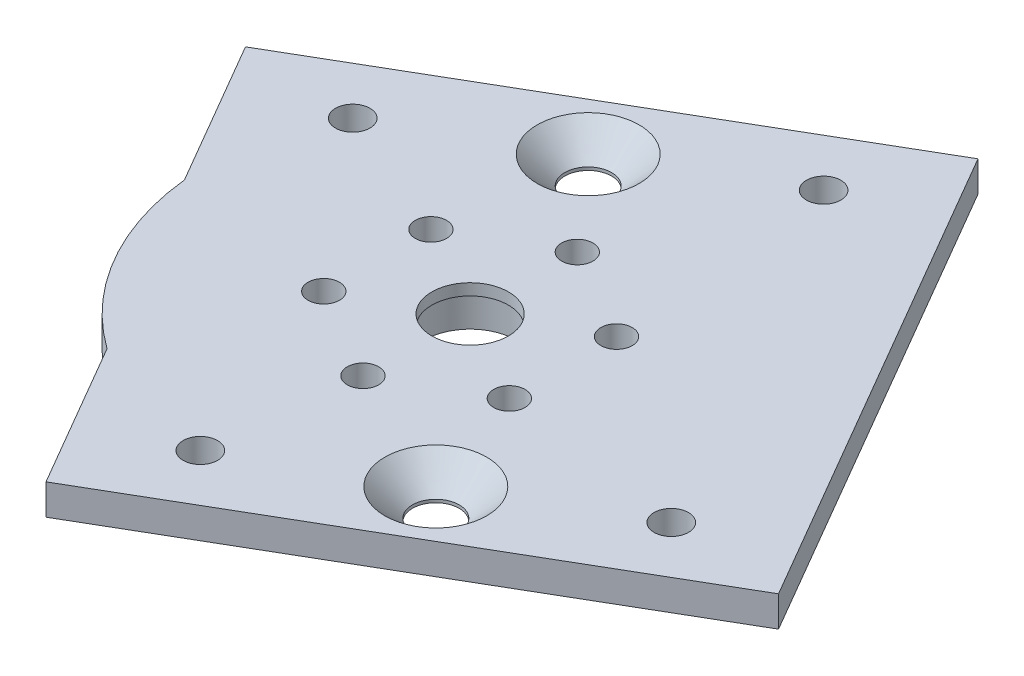
ISO-10303-21;
HEADER;
FILE_DESCRIPTION(('STEP AP214'),'2;1');
FILE_NAME('part.step','',(''),(''),'','','');
FILE_SCHEMA(('AUTOMOTIVE_DESIGN { 1 0 10303 214 1 1 1 1 }'));
ENDSEC;
DATA;
#1=APPLICATION_CONTEXT('core data for automotive mechanical design processes');
#2=APPLICATION_PROTOCOL_DEFINITION('international standard','automotive_design',2000,#1);
#3=PRODUCT_CONTEXT('',#1,'mechanical');
#4=PRODUCT('Part','Part','',(#3));
#5=PRODUCT_RELATED_PRODUCT_CATEGORY('part','',(#4));
#6=PRODUCT_DEFINITION_FORMATION('','',#4);
#7=PRODUCT_DEFINITION_CONTEXT('part definition',#1,'design');
#8=PRODUCT_DEFINITION('design','',#6,#7);
#9=PRODUCT_DEFINITION_SHAPE('','',#8);
#10=(LENGTH_UNIT() NAMED_UNIT(*) SI_UNIT(.MILLI.,.METRE.));
#11=(NAMED_UNIT(*) PLANE_ANGLE_UNIT() SI_UNIT($,.RADIAN.));
#12=(NAMED_UNIT(*) SI_UNIT($,.STERADIAN.) SOLID_ANGLE_UNIT());
#13=UNCERTAINTY_MEASURE_WITH_UNIT(LENGTH_MEASURE(1.E-05),#10,'distance_accuracy_value','');
#14=(GEOMETRIC_REPRESENTATION_CONTEXT(3) GLOBAL_UNCERTAINTY_ASSIGNED_CONTEXT((#13)) GLOBAL_UNIT_ASSIGNED_CONTEXT((#10,
#11,#12)) REPRESENTATION_CONTEXT('',''));
#15=CARTESIAN_POINT('',(0.,0.,0.));
#16=DIRECTION('',(0.,0.,1.));
#17=DIRECTION('',(1.,0.,0.));
#18=AXIS2_PLACEMENT_3D('',#15,#16,#17);
#19=CARTESIAN_POINT('',(0.,0.,0.));
#20=DIRECTION('',(0.,1.,0.));
#21=DIRECTION('',(0.,0.,1.));
#22=AXIS2_PLACEMENT_3D('',#19,#20,#21);
#23=PLANE('',#22);
#24=CARTESIAN_POINT('',(36.7309988166005,0.,10.4562768677418));
#25=DIRECTION('',(0.,-1.,0.));
#26=DIRECTION('',(0.,0.,-1.));
#27=AXIS2_PLACEMENT_3D('',#24,#25,#26);
#28=CIRCLE('',#27,2.25);
#29=CARTESIAN_POINT('',(36.7309988166005,0.,8.20627686774178));
#30=VERTEX_POINT('',#29);
#31=EDGE_CURVE('E248',#30,#30,#28,.T.);
#32=ORIENTED_EDGE('',*,*,#31,.F.);
#33=EDGE_LOOP('',(#32));
#34=FACE_BOUND('',#33,.T.);
#35=CARTESIAN_POINT('',(17.2790417673626,0.,21.764299106604));
#36=DIRECTION('',(0.,-1.,0.));
#37=DIRECTION('',(0.,0.,-1.));
#38=AXIS2_PLACEMENT_3D('',#35,#36,#37);
#39=CIRCLE('',#38,3.05);
#40=CARTESIAN_POINT('',(17.2790417673626,0.,18.714299106604));
#41=VERTEX_POINT('',#40);
#42=EDGE_CURVE('E328',#41,#41,#39,.T.);
#43=ORIENTED_EDGE('',*,*,#42,.F.);
#44=EDGE_LOOP('',(#43));
#45=FACE_BOUND('',#44,.T.);
#46=CARTESIAN_POINT('',(-2.17291528187535,0.,33.0723213454662));
#47=DIRECTION('',(0.,-1.,0.));
#48=DIRECTION('',(0.,0.,-1.));
#49=AXIS2_PLACEMENT_3D('',#46,#47,#48);
#50=CIRCLE('',#49,2.25);
#51=CARTESIAN_POINT('',(-2.17291528187535,0.,30.8223213454662));
#52=VERTEX_POINT('',#51);
#53=EDGE_CURVE('E323',#52,#52,#50,.T.);
#54=ORIENTED_EDGE('',*,*,#53,.F.);
#55=EDGE_LOOP('',(#54));
#56=FACE_BOUND('',#55,.T.);
#57=CARTESIAN_POINT('',(9.08916667715952,0.,-37.0929514748398));
#58=DIRECTION('',(0.,-1.,0.));
#59=DIRECTION('',(0.,0.,-1.));
#60=AXIS2_PLACEMENT_3D('',#57,#58,#59);
#61=CIRCLE('',#60,2.25);
#62=CARTESIAN_POINT('',(9.08916667715952,0.,-39.3429514748398));
#63=VERTEX_POINT('',#62);
#64=EDGE_CURVE('E332',#63,#63,#61,.T.);
#65=ORIENTED_EDGE('',*,*,#64,.F.);
#66=EDGE_LOOP('',(#65));
#67=FACE_BOUND('',#66,.T.);
#68=CARTESIAN_POINT('',(-12.1243556529822,0.,-6.99999999999905));
#69=DIRECTION('',(0.,1.,0.));
#70=DIRECTION('',(0.,0.,1.));
#71=AXIS2_PLACEMENT_3D('',#68,#69,#70);
#72=CIRCLE('',#71,2.05000000000121);
#73=CARTESIAN_POINT('',(-12.1243556529822,0.,-4.94999999999784));
#74=VERTEX_POINT('',#73);
#75=EDGE_CURVE('E181',#74,#74,#72,.T.);
#76=ORIENTED_EDGE('',*,*,#75,.T.);
#77=EDGE_LOOP('',(#76));
#78=FACE_BOUND('',#77,.T.);
#79=CARTESIAN_POINT('',(-12.1243556529807,0.,7.00000000000087));
#80=DIRECTION('',(0.,1.,0.));
#81=DIRECTION('',(0.,0.,1.));
#82=AXIS2_PLACEMENT_3D('',#79,#80,#81);
#83=CIRCLE('',#82,2.05000000000208);
#84=CARTESIAN_POINT('',(-12.1243556529807,0.,9.05000000000295));
#85=VERTEX_POINT('',#84);
#86=EDGE_CURVE('E189',#85,#85,#83,.T.);
#87=ORIENTED_EDGE('',*,*,#86,.T.);
#88=EDGE_LOOP('',(#87));
#89=FACE_BOUND('',#88,.T.);
#90=CARTESIAN_POINT('',(1.98437614357186E-12,0.,14.));
#91=DIRECTION('',(0.,1.,0.));
#92=DIRECTION('',(0.,0.,1.));
#93=AXIS2_PLACEMENT_3D('',#90,#91,#92);
#94=CIRCLE('',#93,2.05000000000225);
#95=CARTESIAN_POINT('',(1.98437614357186E-12,0.,16.0500000000022));
#96=VERTEX_POINT('',#95);
#97=EDGE_CURVE('E197',#96,#96,#94,.T.);
#98=ORIENTED_EDGE('',*,*,#97,.T.);
#99=EDGE_LOOP('',(#98));
#100=FACE_BOUND('',#99,.T.);
#101=CARTESIAN_POINT('',(12.1243556529836,0.,6.99999999999914));
#102=DIRECTION('',(0.,1.,0.));
#103=DIRECTION('',(0.,0.,1.));
#104=AXIS2_PLACEMENT_3D('',#101,#102,#103);
#105=CIRCLE('',#104,2.05000000000147);
#106=CARTESIAN_POINT('',(12.1243556529836,0.,9.05000000000061));
#107=VERTEX_POINT('',#106);
#108=EDGE_CURVE('E205',#107,#107,#105,.T.);
#109=ORIENTED_EDGE('',*,*,#108,.T.);
#110=EDGE_LOOP('',(#109));
#111=FACE_BOUND('',#110,.T.);
#112=CARTESIAN_POINT('',(12.1243556529826,0.,-7.00000000000086));
#113=DIRECTION('',(0.,1.,0.));
#114=DIRECTION('',(0.,0.,1.));
#115=AXIS2_PLACEMENT_3D('',#112,#113,#114);
#116=CIRCLE('',#115,2.05000000000028);
#117=CARTESIAN_POINT('',(12.1243556529826,0.,-4.95000000000058));
#118=VERTEX_POINT('',#117);
#119=EDGE_CURVE('E213',#118,#118,#116,.T.);
#120=ORIENTED_EDGE('',*,*,#119,.T.);
#121=EDGE_LOOP('',(#120));
#122=FACE_BOUND('',#121,.T.);
#123=CARTESIAN_POINT('',(0.,0.,-14.));
#124=DIRECTION('',(0.,1.,0.));
#125=DIRECTION('',(0.,0.,1.));
#126=AXIS2_PLACEMENT_3D('',#123,#124,#125);
#127=CIRCLE('',#126,2.05);
#128=CARTESIAN_POINT('',(0.,0.,-11.95));
#129=VERTEX_POINT('',#128);
#130=EDGE_CURVE('E221',#129,#129,#127,.T.);
#131=ORIENTED_EDGE('',*,*,#130,.T.);
#132=EDGE_LOOP('',(#131));
#133=FACE_BOUND('',#132,.T.);
#134=CARTESIAN_POINT('',(0.,0.,0.));
#135=DIRECTION('',(0.,1.,0.));
#136=DIRECTION('',(0.,0.,1.));
#137=AXIS2_PLACEMENT_3D('',#134,#135,#136);
#138=CIRCLE('',#137,34.);
#139=CARTESIAN_POINT('',(-33.81860468845,0.,3.50741741547083));
#140=VERTEX_POINT('',#139);
#141=CARTESIAN_POINT('',(-19.7823436250058,0.,27.6524660871719));
#142=VERTEX_POINT('',#141);
#143=EDGE_CURVE('E229',#140,#142,#138,.T.);
#144=ORIENTED_EDGE('',*,*,#143,.F.);
#145=DIRECTION('',(-0.502578766171655,0.,-0.864531424410575));
#146=VECTOR('',#145,1.);
#147=CARTESIAN_POINT('',(-26.8004741567279,0.,15.5799417513214));
#148=LINE('',#147,#146);
#149=CARTESIAN_POINT('',(-44.8933097389076,0.,-15.5431895274595));
#150=VERTEX_POINT('',#149);
#151=EDGE_CURVE('E78',#140,#150,#148,.T.);
#152=ORIENTED_EDGE('',*,*,#151,.T.);
#153=DIRECTION('',(-0.864531424410575,0.,0.502578766171655));
#154=VECTOR('',#153,1.);
#155=CARTESIAN_POINT('',(-18.0928355821797,0.,-31.1231312787809));
#156=LINE('',#155,#154);
#157=CARTESIAN_POINT('',(15.6238899698326,0.,-50.7237031594753));
#158=VERTEX_POINT('',#157);
#159=EDGE_CURVE('E118',#158,#150,#156,.T.);
#160=ORIENTED_EDGE('',*,*,#159,.F.);
#161=DIRECTION('',(-0.502578766171655,0.,-0.864531424410575));
#162=VECTOR('',#161,1.);
#163=CARTESIAN_POINT('',(33.7167255520123,0.,-19.6005718806945));
#164=LINE('',#163,#162);
#165=CARTESIAN_POINT('',(51.8095611341918,0.,11.522559398086));
#166=VERTEX_POINT('',#165);
#167=EDGE_CURVE('E130',#166,#158,#164,.T.);
#168=ORIENTED_EDGE('',*,*,#167,.F.);
#169=DIRECTION('',(-0.864531424410575,0.,0.502578766171655));
#170=VECTOR('',#169,1.);
#171=CARTESIAN_POINT('',(18.0928355821794,0.,31.1231312787805));
#172=LINE('',#171,#170);
#173=CARTESIAN_POINT('',(-8.70763857454847,0.,46.7030730301018));
#174=VERTEX_POINT('',#173);
#175=EDGE_CURVE('E136',#166,#174,#172,.T.);
#176=ORIENTED_EDGE('',*,*,#175,.T.);
#177=EDGE_CURVE('E108',#174,#142,#148,.T.);
#178=ORIENTED_EDGE('',*,*,#177,.T.);
#179=EDGE_LOOP('',(#144,#152,#160,#168,#176,#178));
#180=FACE_BOUND('',#179,.T.);
#181=CARTESIAN_POINT('',(0.,0.,0.));
#182=DIRECTION('',(0.,1.,0.));
#183=DIRECTION('',(0.,0.,1.));
#184=AXIS2_PLACEMENT_3D('',#181,#182,#183);
#185=CIRCLE('',#184,7.);
#186=CARTESIAN_POINT('',(0.,0.,7.));
#187=VERTEX_POINT('',#186);
#188=EDGE_CURVE('E236',#187,#187,#185,.F.);
#189=ORIENTED_EDGE('',*,*,#188,.F.);
#190=EDGE_LOOP('',(#189));
#191=FACE_BOUND('',#190,.T.);
#192=CARTESIAN_POINT('',(-10.3627903720784,0.,-25.7849292359776));
#193=DIRECTION('',(0.,-1.,0.));
#194=DIRECTION('',(0.,0.,-1.));
#195=AXIS2_PLACEMENT_3D('',#192,#193,#194);
#196=CIRCLE('',#195,3.05000000000001);
#197=CARTESIAN_POINT('',(-10.3627903720784,0.,-28.8349292359776));
#198=VERTEX_POINT('',#197);
#199=EDGE_CURVE('E324',#198,#198,#196,.F.);
#200=ORIENTED_EDGE('',*,*,#199,.T.);
#201=EDGE_LOOP('',(#200));
#202=FACE_BOUND('',#201,.T.);
#203=CARTESIAN_POINT('',(-29.8147474213163,0.,-14.4769069971153));
#204=DIRECTION('',(0.,-1.,0.));
#205=DIRECTION('',(0.,0.,-1.));
#206=AXIS2_PLACEMENT_3D('',#203,#204,#205);
#207=CIRCLE('',#206,2.25);
#208=CARTESIAN_POINT('',(-29.8147474213163,0.,-16.7269069971153));
#209=VERTEX_POINT('',#208);
#210=EDGE_CURVE('E320',#209,#209,#207,.F.);
#211=ORIENTED_EDGE('',*,*,#210,.T.);
#212=EDGE_LOOP('',(#211));
#213=FACE_BOUND('',#212,.T.);
#214=ADVANCED_FACE('F55',(#34,#45,#56,#67,#78,#89,#100,#111,#122,#133,#180,#191,#202,#213),#23,.F.);
#215=CARTESIAN_POINT('',(0.,4.,0.));
#216=DIRECTION('',(0.,1.,0.));
#217=DIRECTION('',(0.,0.,1.));
#218=AXIS2_PLACEMENT_3D('',#215,#216,#217);
#219=PLANE('',#218);
#220=CARTESIAN_POINT('',(-10.3627903720784,4.,-25.7849292359776));
#221=DIRECTION('',(0.,1.,0.));
#222=DIRECTION('',(0.,0.,1.));
#223=AXIS2_PLACEMENT_3D('',#220,#221,#222);
#224=CIRCLE('',#223,6.65000000000002);
#225=CARTESIAN_POINT('',(-10.3627903720784,4.,-19.1349292359775));
#226=VERTEX_POINT('',#225);
#227=EDGE_CURVE('E262',#226,#226,#224,.F.);
#228=ORIENTED_EDGE('',*,*,#227,.T.);
#229=EDGE_LOOP('',(#228));
#230=FACE_BOUND('',#229,.T.);
#231=CARTESIAN_POINT('',(17.2790417673626,4.,21.764299106604));
#232=DIRECTION('',(0.,1.,0.));
#233=DIRECTION('',(0.,0.,1.));
#234=AXIS2_PLACEMENT_3D('',#231,#232,#233);
#235=CIRCLE('',#234,6.65000000000002);
#236=CARTESIAN_POINT('',(17.2790417673626,4.,28.414299106604));
#237=VERTEX_POINT('',#236);
#238=EDGE_CURVE('E242',#237,#237,#235,.F.);
#239=ORIENTED_EDGE('',*,*,#238,.T.);
#240=EDGE_LOOP('',(#239));
#241=FACE_BOUND('',#240,.T.);
#242=CARTESIAN_POINT('',(36.7309988166005,4.,10.4562768677418));
#243=DIRECTION('',(0.,1.,0.));
#244=DIRECTION('',(0.,0.,1.));
#245=AXIS2_PLACEMENT_3D('',#242,#243,#244);
#246=CIRCLE('',#245,2.25);
#247=CARTESIAN_POINT('',(36.7309988166005,4.,12.7062768677418));
#248=VERTEX_POINT('',#247);
#249=EDGE_CURVE('E149',#248,#248,#246,.T.);
#250=ORIENTED_EDGE('',*,*,#249,.F.);
#251=EDGE_LOOP('',(#250));
#252=FACE_BOUND('',#251,.T.);
#253=CARTESIAN_POINT('',(-2.17291528187535,4.,33.0723213454662));
#254=DIRECTION('',(0.,1.,0.));
#255=DIRECTION('',(0.,0.,1.));
#256=AXIS2_PLACEMENT_3D('',#253,#254,#255);
#257=CIRCLE('',#256,2.25);
#258=CARTESIAN_POINT('',(-2.17291528187535,4.,35.3223213454662));
#259=VERTEX_POINT('',#258);
#260=EDGE_CURVE('E252',#259,#259,#257,.T.);
#261=ORIENTED_EDGE('',*,*,#260,.F.);
#262=EDGE_LOOP('',(#261));
#263=FACE_BOUND('',#262,.T.);
#264=CARTESIAN_POINT('',(9.08916667715952,4.,-37.0929514748398));
#265=DIRECTION('',(0.,1.,0.));
#266=DIRECTION('',(0.,0.,1.));
#267=AXIS2_PLACEMENT_3D('',#264,#265,#266);
#268=CIRCLE('',#267,2.25);
#269=CARTESIAN_POINT('',(9.08916667715952,4.,-34.8429514748398));
#270=VERTEX_POINT('',#269);
#271=EDGE_CURVE('E243',#270,#270,#268,.T.);
#272=ORIENTED_EDGE('',*,*,#271,.F.);
#273=EDGE_LOOP('',(#272));
#274=FACE_BOUND('',#273,.T.);
#275=CARTESIAN_POINT('',(-12.1243556529807,4.,7.00000000000087));
#276=DIRECTION('',(0.,1.,0.));
#277=DIRECTION('',(0.,0.,1.));
#278=AXIS2_PLACEMENT_3D('',#275,#276,#277);
#279=CIRCLE('',#278,2.05000000000208);
#280=CARTESIAN_POINT('',(-12.1243556529807,4.,9.05000000000295));
#281=VERTEX_POINT('',#280);
#282=EDGE_CURVE('E193',#281,#281,#279,.T.);
#283=ORIENTED_EDGE('',*,*,#282,.F.);
#284=EDGE_LOOP('',(#283));
#285=FACE_BOUND('',#284,.T.);
#286=CARTESIAN_POINT('',(12.1243556529836,4.,6.99999999999914));
#287=DIRECTION('',(0.,1.,0.));
#288=DIRECTION('',(0.,0.,1.));
#289=AXIS2_PLACEMENT_3D('',#286,#287,#288);
#290=CIRCLE('',#289,2.05000000000147);
#291=CARTESIAN_POINT('',(12.1243556529836,4.,9.05000000000061));
#292=VERTEX_POINT('',#291);
#293=EDGE_CURVE('E209',#292,#292,#290,.T.);
#294=ORIENTED_EDGE('',*,*,#293,.F.);
#295=EDGE_LOOP('',(#294));
#296=FACE_BOUND('',#295,.T.);
#297=CARTESIAN_POINT('',(0.,4.,0.));
#298=DIRECTION('',(0.,1.,0.));
#299=DIRECTION('',(0.,0.,1.));
#300=AXIS2_PLACEMENT_3D('',#297,#298,#299);
#301=CIRCLE('',#300,34.);
#302=CARTESIAN_POINT('',(-33.81860468845,4.,3.50741741547083));
#303=VERTEX_POINT('',#302);
#304=CARTESIAN_POINT('',(-19.7823436250058,4.,27.6524660871719));
#305=VERTEX_POINT('',#304);
#306=EDGE_CURVE('E232',#303,#305,#301,.T.);
#307=ORIENTED_EDGE('',*,*,#306,.T.);
#308=DIRECTION('',(-0.502578766171655,0.,-0.864531424410575));
#309=VECTOR('',#308,1.);
#310=CARTESIAN_POINT('',(-26.8004741567279,4.,15.5799417513214));
#311=LINE('',#310,#309);
#312=CARTESIAN_POINT('',(-8.70763857454847,4.,46.7030730301018));
#313=VERTEX_POINT('',#312);
#314=EDGE_CURVE('E145',#313,#305,#311,.T.);
#315=ORIENTED_EDGE('',*,*,#314,.F.);
#316=DIRECTION('',(-0.864531424410575,0.,0.502578766171655));
#317=VECTOR('',#316,1.);
#318=CARTESIAN_POINT('',(18.0928355821794,4.,31.1231312787805));
#319=LINE('',#318,#317);
#320=CARTESIAN_POINT('',(51.8095611341918,4.,11.522559398086));
#321=VERTEX_POINT('',#320);
#322=EDGE_CURVE('E148',#321,#313,#319,.T.);
#323=ORIENTED_EDGE('',*,*,#322,.F.);
#324=DIRECTION('',(-0.502578766171655,0.,-0.864531424410575));
#325=VECTOR('',#324,1.);
#326=CARTESIAN_POINT('',(33.7167255520123,4.,-19.6005718806945));
#327=LINE('',#326,#325);
#328=CARTESIAN_POINT('',(15.6238899698326,4.,-50.7237031594753));
#329=VERTEX_POINT('',#328);
#330=EDGE_CURVE('E153',#321,#329,#327,.T.);
#331=ORIENTED_EDGE('',*,*,#330,.T.);
#332=DIRECTION('',(-0.864531424410575,0.,0.502578766171655));
#333=VECTOR('',#332,1.);
#334=CARTESIAN_POINT('',(-18.0928355821797,4.,-31.1231312787809));
#335=LINE('',#334,#333);
#336=CARTESIAN_POINT('',(-44.8933097389076,4.,-15.5431895274595));
#337=VERTEX_POINT('',#336);
#338=EDGE_CURVE('E120',#329,#337,#335,.T.);
#339=ORIENTED_EDGE('',*,*,#338,.T.);
#340=EDGE_CURVE('E150',#303,#337,#311,.T.);
#341=ORIENTED_EDGE('',*,*,#340,.F.);
#342=EDGE_LOOP('',(#307,#315,#323,#331,#339,#341));
#343=FACE_BOUND('',#342,.T.);
#344=CARTESIAN_POINT('',(0.,4.,-14.));
#345=DIRECTION('',(0.,1.,0.));
#346=DIRECTION('',(0.,0.,1.));
#347=AXIS2_PLACEMENT_3D('',#344,#345,#346);
#348=CIRCLE('',#347,2.05);
#349=CARTESIAN_POINT('',(0.,4.,-11.95));
#350=VERTEX_POINT('',#349);
#351=EDGE_CURVE('E225',#350,#350,#348,.T.);
#352=ORIENTED_EDGE('',*,*,#351,.F.);
#353=EDGE_LOOP('',(#352));
#354=FACE_BOUND('',#353,.T.);
#355=CARTESIAN_POINT('',(12.1243556529826,4.,-7.00000000000086));
#356=DIRECTION('',(0.,1.,0.));
#357=DIRECTION('',(0.,0.,1.));
#358=AXIS2_PLACEMENT_3D('',#355,#356,#357);
#359=CIRCLE('',#358,2.05000000000028);
#360=CARTESIAN_POINT('',(12.1243556529826,4.,-4.95000000000058));
#361=VERTEX_POINT('',#360);
#362=EDGE_CURVE('E217',#361,#361,#359,.T.);
#363=ORIENTED_EDGE('',*,*,#362,.F.);
#364=EDGE_LOOP('',(#363));
#365=FACE_BOUND('',#364,.T.);
#366=CARTESIAN_POINT('',(1.98437614357186E-12,4.,14.));
#367=DIRECTION('',(0.,1.,0.));
#368=DIRECTION('',(0.,0.,1.));
#369=AXIS2_PLACEMENT_3D('',#366,#367,#368);
#370=CIRCLE('',#369,2.05000000000225);
#371=CARTESIAN_POINT('',(1.98437614357186E-12,4.,16.0500000000022));
#372=VERTEX_POINT('',#371);
#373=EDGE_CURVE('E201',#372,#372,#370,.T.);
#374=ORIENTED_EDGE('',*,*,#373,.F.);
#375=EDGE_LOOP('',(#374));
#376=FACE_BOUND('',#375,.T.);
#377=CARTESIAN_POINT('',(-12.1243556529822,4.,-6.99999999999905));
#378=DIRECTION('',(0.,1.,0.));
#379=DIRECTION('',(0.,0.,1.));
#380=AXIS2_PLACEMENT_3D('',#377,#378,#379);
#381=CIRCLE('',#380,2.05000000000121);
#382=CARTESIAN_POINT('',(-12.1243556529822,4.,-4.94999999999784));
#383=VERTEX_POINT('',#382);
#384=EDGE_CURVE('E185',#383,#383,#381,.T.);
#385=ORIENTED_EDGE('',*,*,#384,.F.);
#386=EDGE_LOOP('',(#385));
#387=FACE_BOUND('',#386,.T.);
#388=CARTESIAN_POINT('',(0.,4.,0.));
#389=DIRECTION('',(0.,1.,0.));
#390=DIRECTION('',(0.,0.,1.));
#391=AXIS2_PLACEMENT_3D('',#388,#389,#390);
#392=CIRCLE('',#391,5.);
#393=CARTESIAN_POINT('',(0.,4.,5.));
#394=VERTEX_POINT('',#393);
#395=EDGE_CURVE('E176',#394,#394,#392,.T.);
#396=ORIENTED_EDGE('',*,*,#395,.F.);
#397=EDGE_LOOP('',(#396));
#398=FACE_BOUND('',#397,.T.);
#399=CARTESIAN_POINT('',(-29.8147474213163,4.,-14.4769069971153));
#400=DIRECTION('',(0.,1.,0.));
#401=DIRECTION('',(0.,0.,1.));
#402=AXIS2_PLACEMENT_3D('',#399,#400,#401);
#403=CIRCLE('',#402,2.25);
#404=CARTESIAN_POINT('',(-29.8147474213163,4.,-12.2269069971153));
#405=VERTEX_POINT('',#404);
#406=EDGE_CURVE('E247',#405,#405,#403,.F.);
#407=ORIENTED_EDGE('',*,*,#406,.T.);
#408=EDGE_LOOP('',(#407));
#409=FACE_BOUND('',#408,.T.);
#410=ADVANCED_FACE('F281',(#230,#241,#252,#263,#274,#285,#296,#343,#354,#365,#376,#387,#398,
#409),#219,.T.);
#411=CARTESIAN_POINT('',(0.,4.,0.));
#412=DIRECTION('',(0.,-1.,0.));
#413=DIRECTION('',(0.,0.,-1.));
#414=AXIS2_PLACEMENT_3D('',#411,#412,#413);
#415=CYLINDRICAL_SURFACE('',#414,34.);
#416=DIRECTION('',(0.,1.,0.));
#417=VECTOR('',#416,1.);
#418=CARTESIAN_POINT('',(-33.81860468845,0.,3.50741741547083));
#419=LINE('',#418,#417);
#420=EDGE_CURVE('E72',#140,#303,#419,.T.);
#421=ORIENTED_EDGE('',*,*,#420,.F.);
#422=ORIENTED_EDGE('',*,*,#143,.T.);
#423=DIRECTION('',(0.,1.,0.));
#424=VECTOR('',#423,1.);
#425=CARTESIAN_POINT('',(-19.7823436250058,0.,27.6524660871719));
#426=LINE('',#425,#424);
#427=EDGE_CURVE('E169',#142,#305,#426,.T.);
#428=ORIENTED_EDGE('',*,*,#427,.T.);
#429=ORIENTED_EDGE('',*,*,#306,.F.);
#430=EDGE_LOOP('',(#421,#422,#428,#429));
#431=FACE_BOUND('',#430,.T.);
#432=ADVANCED_FACE('F284',(#431),#415,.T.);
#433=CARTESIAN_POINT('',(0.,4.,-14.));
#434=DIRECTION('',(0.,-1.,0.));
#435=DIRECTION('',(0.,0.,-1.));
#436=AXIS2_PLACEMENT_3D('',#433,#434,#435);
#437=CYLINDRICAL_SURFACE('',#436,2.05);
#438=ORIENTED_EDGE('',*,*,#351,.T.);
#439=EDGE_LOOP('',(#438));
#440=FACE_BOUND('',#439,.T.);
#441=ORIENTED_EDGE('',*,*,#130,.F.);
#442=EDGE_LOOP('',(#441));
#443=FACE_BOUND('',#442,.T.);
#444=ADVANCED_FACE('F425',(#440,#443),#437,.F.);
#445=CARTESIAN_POINT('',(12.1243556529826,4.,-7.00000000000086));
#446=DIRECTION('',(0.,-1.,0.));
#447=DIRECTION('',(0.,0.,-1.));
#448=AXIS2_PLACEMENT_3D('',#445,#446,#447);
#449=CYLINDRICAL_SURFACE('',#448,2.05000000000028);
#450=ORIENTED_EDGE('',*,*,#362,.T.);
#451=EDGE_LOOP('',(#450));
#452=FACE_BOUND('',#451,.T.);
#453=ORIENTED_EDGE('',*,*,#119,.F.);
#454=EDGE_LOOP('',(#453));
#455=FACE_BOUND('',#454,.T.);
#456=ADVANCED_FACE('F435',(#452,#455),#449,.F.);
#457=CARTESIAN_POINT('',(12.1243556529836,4.,6.99999999999914));
#458=DIRECTION('',(0.,-1.,0.));
#459=DIRECTION('',(0.,0.,-1.));
#460=AXIS2_PLACEMENT_3D('',#457,#458,#459);
#461=CYLINDRICAL_SURFACE('',#460,2.05000000000147);
#462=ORIENTED_EDGE('',*,*,#293,.T.);
#463=EDGE_LOOP('',(#462));
#464=FACE_BOUND('',#463,.T.);
#465=ORIENTED_EDGE('',*,*,#108,.F.);
#466=EDGE_LOOP('',(#465));
#467=FACE_BOUND('',#466,.T.);
#468=ADVANCED_FACE('F481',(#464,#467),#461,.F.);
#469=CARTESIAN_POINT('',(1.98437614357186E-12,4.,14.));
#470=DIRECTION('',(0.,-1.,0.));
#471=DIRECTION('',(0.,0.,-1.));
#472=AXIS2_PLACEMENT_3D('',#469,#470,#471);
#473=CYLINDRICAL_SURFACE('',#472,2.05000000000225);
#474=ORIENTED_EDGE('',*,*,#373,.T.);
#475=EDGE_LOOP('',(#474));
#476=FACE_BOUND('',#475,.T.);
#477=ORIENTED_EDGE('',*,*,#97,.F.);
#478=EDGE_LOOP('',(#477));
#479=FACE_BOUND('',#478,.T.);
#480=ADVANCED_FACE('F477',(#476,#479),#473,.F.);
#481=CARTESIAN_POINT('',(-12.1243556529807,4.,7.00000000000087));
#482=DIRECTION('',(0.,-1.,0.));
#483=DIRECTION('',(0.,0.,-1.));
#484=AXIS2_PLACEMENT_3D('',#481,#482,#483);
#485=CYLINDRICAL_SURFACE('',#484,2.05000000000208);
#486=ORIENTED_EDGE('',*,*,#282,.T.);
#487=EDGE_LOOP('',(#486));
#488=FACE_BOUND('',#487,.T.);
#489=ORIENTED_EDGE('',*,*,#86,.F.);
#490=EDGE_LOOP('',(#489));
#491=FACE_BOUND('',#490,.T.);
#492=ADVANCED_FACE('F473',(#488,#491),#485,.F.);
#493=CARTESIAN_POINT('',(-12.1243556529822,4.,-6.99999999999905));
#494=DIRECTION('',(0.,-1.,0.));
#495=DIRECTION('',(0.,0.,-1.));
#496=AXIS2_PLACEMENT_3D('',#493,#494,#495);
#497=CYLINDRICAL_SURFACE('',#496,2.05000000000121);
#498=ORIENTED_EDGE('',*,*,#384,.T.);
#499=EDGE_LOOP('',(#498));
#500=FACE_BOUND('',#499,.T.);
#501=ORIENTED_EDGE('',*,*,#75,.F.);
#502=EDGE_LOOP('',(#501));
#503=FACE_BOUND('',#502,.T.);
#504=ADVANCED_FACE('F469',(#500,#503),#497,.F.);
#505=CARTESIAN_POINT('',(0.,2.5,0.));
#506=DIRECTION('',(0.,1.,0.));
#507=DIRECTION('',(0.,0.,1.));
#508=AXIS2_PLACEMENT_3D('',#505,#506,#507);
#509=PLANE('',#508);
#510=CARTESIAN_POINT('',(0.,2.5,0.));
#511=DIRECTION('',(0.,1.,0.));
#512=DIRECTION('',(0.,0.,1.));
#513=AXIS2_PLACEMENT_3D('',#510,#511,#512);
#514=CIRCLE('',#513,5.);
#515=CARTESIAN_POINT('',(0.,2.5,5.));
#516=VERTEX_POINT('',#515);
#517=EDGE_CURVE('E177',#516,#516,#514,.T.);
#518=ORIENTED_EDGE('',*,*,#517,.T.);
#519=EDGE_LOOP('',(#518));
#520=FACE_BOUND('',#519,.T.);
#521=CARTESIAN_POINT('',(0.,2.5,0.));
#522=DIRECTION('',(0.,1.,0.));
#523=DIRECTION('',(0.,0.,1.));
#524=AXIS2_PLACEMENT_3D('',#521,#522,#523);
#525=CIRCLE('',#524,6.05);
#526=CARTESIAN_POINT('',(0.,2.5,6.05));
#527=VERTEX_POINT('',#526);
#528=EDGE_CURVE('E338',#527,#527,#525,.F.);
#529=ORIENTED_EDGE('',*,*,#528,.T.);
#530=EDGE_LOOP('',(#529));
#531=FACE_BOUND('',#530,.T.);
#532=ADVANCED_FACE('F404',(#520,#531),#509,.F.);
#533=CARTESIAN_POINT('',(0.,2.5,0.));
#534=DIRECTION('',(0.,1.,0.));
#535=DIRECTION('',(0.,0.,1.));
#536=AXIS2_PLACEMENT_3D('',#533,#534,#535);
#537=CYLINDRICAL_SURFACE('',#536,5.);
#538=ORIENTED_EDGE('',*,*,#517,.F.);
#539=EDGE_LOOP('',(#538));
#540=FACE_BOUND('',#539,.T.);
#541=ORIENTED_EDGE('',*,*,#395,.T.);
#542=EDGE_LOOP('',(#541));
#543=FACE_BOUND('',#542,.T.);
#544=ADVANCED_FACE('F459',(#540,#543),#537,.F.);
#545=CARTESIAN_POINT('',(0.,-2.,0.));
#546=DIRECTION('',(0.,-1.,0.));
#547=DIRECTION('',(0.,0.,-1.));
#548=AXIS2_PLACEMENT_3D('',#545,#546,#547);
#549=PLANE('',#548);
#550=CARTESIAN_POINT('',(0.,-2.,0.));
#551=DIRECTION('',(0.,-1.,0.));
#552=DIRECTION('',(0.,0.,-1.));
#553=AXIS2_PLACEMENT_3D('',#550,#551,#552);
#554=CIRCLE('',#553,6.05);
#555=CARTESIAN_POINT('',(0.,-2.,-6.05));
#556=VERTEX_POINT('',#555);
#557=EDGE_CURVE('E391',#556,#556,#554,.T.);
#558=ORIENTED_EDGE('',*,*,#557,.F.);
#559=EDGE_LOOP('',(#558));
#560=FACE_BOUND('',#559,.T.);
#561=CARTESIAN_POINT('',(0.,-2.,0.));
#562=DIRECTION('',(0.,-1.,0.));
#563=DIRECTION('',(0.,0.,-1.));
#564=AXIS2_PLACEMENT_3D('',#561,#562,#563);
#565=CIRCLE('',#564,7.);
#566=CARTESIAN_POINT('',(0.,-2.,-7.));
#567=VERTEX_POINT('',#566);
#568=EDGE_CURVE('E160',#567,#567,#565,.T.);
#569=ORIENTED_EDGE('',*,*,#568,.T.);
#570=EDGE_LOOP('',(#569));
#571=FACE_BOUND('',#570,.T.);
#572=ADVANCED_FACE('F455',(#560,#571),#549,.T.);
#573=CARTESIAN_POINT('',(0.,-2.,0.));
#574=DIRECTION('',(0.,1.,0.));
#575=DIRECTION('',(0.,0.,1.));
#576=AXIS2_PLACEMENT_3D('',#573,#574,#575);
#577=CYLINDRICAL_SURFACE('',#576,7.);
#578=ORIENTED_EDGE('',*,*,#568,.F.);
#579=EDGE_LOOP('',(#578));
#580=FACE_BOUND('',#579,.T.);
#581=ORIENTED_EDGE('',*,*,#188,.T.);
#582=EDGE_LOOP('',(#581));
#583=FACE_BOUND('',#582,.T.);
#584=ADVANCED_FACE('F458',(#580,#583),#577,.T.);
#585=CARTESIAN_POINT('',(-26.8004741567279,0.,15.5799417513214));
#586=DIRECTION('',(0.864531424410575,0.,-0.502578766171655));
#587=DIRECTION('',(-0.502578766171655,0.,-0.864531424410575));
#588=AXIS2_PLACEMENT_3D('',#585,#586,#587);
#589=PLANE('',#588);
#590=ORIENTED_EDGE('',*,*,#340,.T.);
#591=DIRECTION('',(0.,1.,0.));
#592=VECTOR('',#591,1.);
#593=CARTESIAN_POINT('',(-44.8933097389076,0.,-15.5431895274595));
#594=LINE('',#593,#592);
#595=EDGE_CURVE('E100',#150,#337,#594,.T.);
#596=ORIENTED_EDGE('',*,*,#595,.F.);
#597=ORIENTED_EDGE('',*,*,#151,.F.);
#598=ORIENTED_EDGE('',*,*,#420,.T.);
#599=EDGE_LOOP('',(#590,#596,#597,#598));
#600=FACE_BOUND('',#599,.T.);
#601=ADVANCED_FACE('F451',(#600),#589,.F.);
#602=CARTESIAN_POINT('',(-18.0928355821797,0.,-31.1231312787809));
#603=DIRECTION('',(-0.502578766171655,0.,-0.864531424410575));
#604=DIRECTION('',(-0.864531424410575,0.,0.502578766171655));
#605=AXIS2_PLACEMENT_3D('',#602,#603,#604);
#606=PLANE('',#605);
#607=ORIENTED_EDGE('',*,*,#338,.F.);
#608=DIRECTION('',(0.,1.,0.));
#609=VECTOR('',#608,1.);
#610=CARTESIAN_POINT('',(15.6238899698326,0.,-50.7237031594753));
#611=LINE('',#610,#609);
#612=EDGE_CURVE('E115',#158,#329,#611,.T.);
#613=ORIENTED_EDGE('',*,*,#612,.F.);
#614=ORIENTED_EDGE('',*,*,#159,.T.);
#615=ORIENTED_EDGE('',*,*,#595,.T.);
#616=EDGE_LOOP('',(#607,#613,#614,#615));
#617=FACE_BOUND('',#616,.T.);
#618=ADVANCED_FACE('F117',(#617),#606,.T.);
#619=CARTESIAN_POINT('',(33.7167255520123,0.,-19.6005718806945));
#620=DIRECTION('',(0.864531424410575,0.,-0.502578766171655));
#621=DIRECTION('',(-0.502578766171655,0.,-0.864531424410575));
#622=AXIS2_PLACEMENT_3D('',#619,#620,#621);
#623=PLANE('',#622);
#624=ORIENTED_EDGE('',*,*,#330,.F.);
#625=DIRECTION('',(0.,1.,0.));
#626=VECTOR('',#625,1.);
#627=CARTESIAN_POINT('',(51.8095611341918,0.,11.522559398086));
#628=LINE('',#627,#626);
#629=EDGE_CURVE('E126',#166,#321,#628,.T.);
#630=ORIENTED_EDGE('',*,*,#629,.F.);
#631=ORIENTED_EDGE('',*,*,#167,.T.);
#632=ORIENTED_EDGE('',*,*,#612,.T.);
#633=EDGE_LOOP('',(#624,#630,#631,#632));
#634=FACE_BOUND('',#633,.T.);
#635=ADVANCED_FACE('F133',(#634),#623,.T.);
#636=CARTESIAN_POINT('',(18.0928355821794,0.,31.1231312787805));
#637=DIRECTION('',(-0.502578766171655,0.,-0.864531424410575));
#638=DIRECTION('',(-0.864531424410575,0.,0.502578766171655));
#639=AXIS2_PLACEMENT_3D('',#636,#637,#638);
#640=PLANE('',#639);
#641=ORIENTED_EDGE('',*,*,#322,.T.);
#642=DIRECTION('',(0.,1.,0.));
#643=VECTOR('',#642,1.);
#644=CARTESIAN_POINT('',(-8.70763857454847,0.,46.7030730301018));
#645=LINE('',#644,#643);
#646=EDGE_CURVE('E165',#174,#313,#645,.T.);
#647=ORIENTED_EDGE('',*,*,#646,.F.);
#648=ORIENTED_EDGE('',*,*,#175,.F.);
#649=ORIENTED_EDGE('',*,*,#629,.T.);
#650=EDGE_LOOP('',(#641,#647,#648,#649));
#651=FACE_BOUND('',#650,.T.);
#652=ADVANCED_FACE('F442',(#651),#640,.F.);
#653=ORIENTED_EDGE('',*,*,#314,.T.);
#654=ORIENTED_EDGE('',*,*,#427,.F.);
#655=ORIENTED_EDGE('',*,*,#177,.F.);
#656=ORIENTED_EDGE('',*,*,#646,.T.);
#657=EDGE_LOOP('',(#653,#654,#655,#656));
#658=FACE_BOUND('',#657,.T.);
#659=ADVANCED_FACE('F438',(#658),#589,.F.);
#660=CARTESIAN_POINT('',(9.08916667715952,10.,-37.0929514748398));
#661=DIRECTION('',(0.,-1.,0.));
#662=DIRECTION('',(0.,0.,-1.));
#663=AXIS2_PLACEMENT_3D('',#660,#661,#662);
#664=CYLINDRICAL_SURFACE('',#663,2.25);
#665=ORIENTED_EDGE('',*,*,#271,.T.);
#666=EDGE_LOOP('',(#665));
#667=FACE_BOUND('',#666,.T.);
#668=ORIENTED_EDGE('',*,*,#64,.T.);
#669=EDGE_LOOP('',(#668));
#670=FACE_BOUND('',#669,.T.);
#671=ADVANCED_FACE('F449',(#667,#670),#664,.F.);
#672=CARTESIAN_POINT('',(-10.3627903720784,10.,-25.7849292359776));
#673=DIRECTION('',(0.,-1.,0.));
#674=DIRECTION('',(0.,0.,-1.));
#675=AXIS2_PLACEMENT_3D('',#672,#673,#674);
#676=CYLINDRICAL_SURFACE('',#675,3.05000000000001);
#677=CARTESIAN_POINT('',(-10.3627903720784,0.399999999999961,-25.7849292359776));
#678=DIRECTION('',(0.,1.,0.));
#679=DIRECTION('',(0.,0.,1.));
#680=AXIS2_PLACEMENT_3D('',#677,#678,#679);
#681=CIRCLE('',#680,3.05000000000001);
#682=CARTESIAN_POINT('',(-10.3627903720784,0.399999999999961,-22.7349292359775));
#683=VERTEX_POINT('',#682);
#684=EDGE_CURVE('E65',#683,#683,#681,.T.);
#685=ORIENTED_EDGE('',*,*,#684,.T.);
#686=EDGE_LOOP('',(#685));
#687=FACE_BOUND('',#686,.T.);
#688=ORIENTED_EDGE('',*,*,#199,.F.);
#689=EDGE_LOOP('',(#688));
#690=FACE_BOUND('',#689,.T.);
#691=ADVANCED_FACE('F272',(#687,#690),#676,.F.);
#692=CARTESIAN_POINT('',(-29.8147474213163,10.,-14.4769069971153));
#693=DIRECTION('',(0.,-1.,0.));
#694=DIRECTION('',(0.,0.,-1.));
#695=AXIS2_PLACEMENT_3D('',#692,#693,#694);
#696=CYLINDRICAL_SURFACE('',#695,2.25);
#697=ORIENTED_EDGE('',*,*,#406,.F.);
#698=EDGE_LOOP('',(#697));
#699=FACE_BOUND('',#698,.T.);
#700=ORIENTED_EDGE('',*,*,#210,.F.);
#701=EDGE_LOOP('',(#700));
#702=FACE_BOUND('',#701,.T.);
#703=ADVANCED_FACE('F313',(#699,#702),#696,.F.);
#704=CARTESIAN_POINT('',(-2.17291528187535,10.,33.0723213454662));
#705=DIRECTION('',(0.,-1.,0.));
#706=DIRECTION('',(0.,0.,-1.));
#707=AXIS2_PLACEMENT_3D('',#704,#705,#706);
#708=CYLINDRICAL_SURFACE('',#707,2.25);
#709=ORIENTED_EDGE('',*,*,#260,.T.);
#710=EDGE_LOOP('',(#709));
#711=FACE_BOUND('',#710,.T.);
#712=ORIENTED_EDGE('',*,*,#53,.T.);
#713=EDGE_LOOP('',(#712));
#714=FACE_BOUND('',#713,.T.);
#715=ADVANCED_FACE('F316',(#711,#714),#708,.F.);
#716=CARTESIAN_POINT('',(17.2790417673626,10.,21.764299106604));
#717=DIRECTION('',(0.,-1.,0.));
#718=DIRECTION('',(0.,0.,-1.));
#719=AXIS2_PLACEMENT_3D('',#716,#717,#718);
#720=CYLINDRICAL_SURFACE('',#719,3.05);
#721=CARTESIAN_POINT('',(17.2790417673626,0.400000000000003,21.764299106604));
#722=DIRECTION('',(0.,1.,0.));
#723=DIRECTION('',(0.,0.,1.));
#724=AXIS2_PLACEMENT_3D('',#721,#722,#723);
#725=CIRCLE('',#724,3.05);
#726=CARTESIAN_POINT('',(17.2790417673626,0.400000000000003,24.814299106604));
#727=VERTEX_POINT('',#726);
#728=EDGE_CURVE('E12',#727,#727,#725,.T.);
#729=ORIENTED_EDGE('',*,*,#728,.T.);
#730=EDGE_LOOP('',(#729));
#731=FACE_BOUND('',#730,.T.);
#732=ORIENTED_EDGE('',*,*,#42,.T.);
#733=EDGE_LOOP('',(#732));
#734=FACE_BOUND('',#733,.T.);
#735=ADVANCED_FACE('F571',(#731,#734),#720,.F.);
#736=CARTESIAN_POINT('',(36.7309988166005,10.,10.4562768677418));
#737=DIRECTION('',(0.,-1.,0.));
#738=DIRECTION('',(0.,0.,-1.));
#739=AXIS2_PLACEMENT_3D('',#736,#737,#738);
#740=CYLINDRICAL_SURFACE('',#739,2.25);
#741=ORIENTED_EDGE('',*,*,#249,.T.);
#742=EDGE_LOOP('',(#741));
#743=FACE_BOUND('',#742,.T.);
#744=ORIENTED_EDGE('',*,*,#31,.T.);
#745=EDGE_LOOP('',(#744));
#746=FACE_BOUND('',#745,.T.);
#747=ADVANCED_FACE('F278',(#743,#746),#740,.F.);
#748=CARTESIAN_POINT('',(-10.3627903720784,4.,-25.7849292359776));
#749=DIRECTION('',(0.,1.,0.));
#750=DIRECTION('',(0.,0.,1.));
#751=AXIS2_PLACEMENT_3D('',#748,#749,#750);
#752=CONICAL_SURFACE('',#751,6.65000000000002,0.785398163397444);
#753=ORIENTED_EDGE('',*,*,#684,.F.);
#754=EDGE_LOOP('',(#753));
#755=FACE_BOUND('',#754,.T.);
#756=ORIENTED_EDGE('',*,*,#227,.F.);
#757=EDGE_LOOP('',(#756));
#758=FACE_BOUND('',#757,.T.);
#759=ADVANCED_FACE('F275',(#755,#758),#752,.F.);
#760=CARTESIAN_POINT('',(17.2790417673626,0.400000000000003,21.764299106604));
#761=DIRECTION('',(0.,1.,0.));
#762=DIRECTION('',(0.,0.,1.));
#763=AXIS2_PLACEMENT_3D('',#760,#761,#762);
#764=CONICAL_SURFACE('',#763,3.05,0.785398163397451);
#765=ORIENTED_EDGE('',*,*,#238,.F.);
#766=EDGE_LOOP('',(#765));
#767=FACE_BOUND('',#766,.T.);
#768=ORIENTED_EDGE('',*,*,#728,.F.);
#769=EDGE_LOOP('',(#768));
#770=FACE_BOUND('',#769,.T.);
#771=ADVANCED_FACE('F58',(#767,#770),#764,.F.);
#772=CARTESIAN_POINT('',(0.,19.6119841047145,0.));
#773=DIRECTION('',(0.,-1.,0.));
#774=DIRECTION('',(0.,0.,-1.));
#775=AXIS2_PLACEMENT_3D('',#772,#773,#774);
#776=CYLINDRICAL_SURFACE('',#775,6.05);
#777=ORIENTED_EDGE('',*,*,#557,.T.);
#778=EDGE_LOOP('',(#777));
#779=FACE_BOUND('',#778,.T.);
#780=ORIENTED_EDGE('',*,*,#528,.F.);
#781=EDGE_LOOP('',(#780));
#782=FACE_BOUND('',#781,.T.);
#783=ADVANCED_FACE('F406',(#779,#782),#776,.F.);
#784=CLOSED_SHELL('',(#214,#410,#432,#444,#456,#468,#480,#492,#504,#532,#544,#572,#584,#601,
#618,#635,#652,#659,#671,#691,#703,#715,#735,#747,#759,#771,#783));
#785=MANIFOLD_SOLID_BREP('B2',#784);
#786=ADVANCED_BREP_SHAPE_REPRESENTATION('',(#18,#785),#14);
#787=SHAPE_DEFINITION_REPRESENTATION(#9,#786);
ENDSEC;
END-ISO-10303-21;
